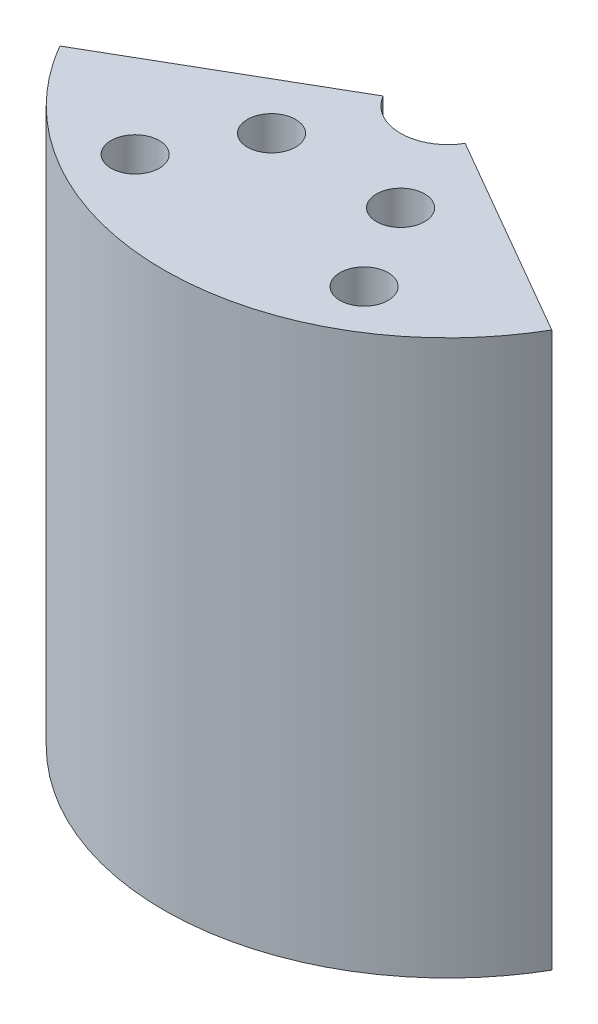
ISO-10303-21;
HEADER;
FILE_DESCRIPTION(('STEP AP214'),'2;1');
FILE_NAME('part.step','',(''),(''),'','','');
FILE_SCHEMA(('AUTOMOTIVE_DESIGN { 1 0 10303 214 1 1 1 1 }'));
ENDSEC;
DATA;
#1=APPLICATION_CONTEXT('core data for automotive mechanical design processes');
#2=APPLICATION_PROTOCOL_DEFINITION('international standard','automotive_design',2000,#1);
#3=PRODUCT_CONTEXT('',#1,'mechanical');
#4=PRODUCT('Part','Part','',(#3));
#5=PRODUCT_RELATED_PRODUCT_CATEGORY('part','',(#4));
#6=PRODUCT_DEFINITION_FORMATION('','',#4);
#7=PRODUCT_DEFINITION_CONTEXT('part definition',#1,'design');
#8=PRODUCT_DEFINITION('design','',#6,#7);
#9=PRODUCT_DEFINITION_SHAPE('','',#8);
#10=(LENGTH_UNIT() NAMED_UNIT(*) SI_UNIT(.MILLI.,.METRE.));
#11=(NAMED_UNIT(*) PLANE_ANGLE_UNIT() SI_UNIT($,.RADIAN.));
#12=(NAMED_UNIT(*) SI_UNIT($,.STERADIAN.) SOLID_ANGLE_UNIT());
#13=UNCERTAINTY_MEASURE_WITH_UNIT(LENGTH_MEASURE(1.E-05),#10,'distance_accuracy_value','');
#14=(GEOMETRIC_REPRESENTATION_CONTEXT(3) GLOBAL_UNCERTAINTY_ASSIGNED_CONTEXT((#13)) GLOBAL_UNIT_ASSIGNED_CONTEXT((#10,
#11,#12)) REPRESENTATION_CONTEXT('',''));
#15=CARTESIAN_POINT('',(0.,0.,0.));
#16=DIRECTION('',(0.,0.,1.));
#17=DIRECTION('',(1.,0.,0.));
#18=AXIS2_PLACEMENT_3D('',#15,#16,#17);
#19=CARTESIAN_POINT('',(-33250.,-157953.272,57590.689));
#20=DIRECTION('',(0.,1.,0.));
#21=DIRECTION('',(0.,0.,1.));
#22=AXIS2_PLACEMENT_3D('',#19,#20,#21);
#23=CYLINDRICAL_SURFACE('',#22,7000.00015026314);
#24=CARTESIAN_POINT('',(-33250.,-157953.272,57590.689));
#25=DIRECTION('',(0.,-1.,0.));
#26=DIRECTION('',(0.,0.,-1.));
#27=AXIS2_PLACEMENT_3D('',#24,#25,#26);
#28=CIRCLE('',#27,7000.00015026314);
#29=CARTESIAN_POINT('',(-33250.,-157953.272,50590.6888497369));
#30=VERTEX_POINT('',#29);
#31=EDGE_CURVE('E205',#30,#30,#28,.T.);
#32=ORIENTED_EDGE('',*,*,#31,.T.);
#33=EDGE_LOOP('',(#32));
#34=FACE_BOUND('',#33,.T.);
#35=CARTESIAN_POINT('',(-33250.,3112.15999999999,57590.689));
#36=DIRECTION('',(0.,1.,0.));
#37=DIRECTION('',(0.,0.,1.));
#38=AXIS2_PLACEMENT_3D('',#35,#36,#37);
#39=CIRCLE('',#38,7000.00015026314);
#40=CARTESIAN_POINT('',(-33250.,3112.15999999999,64590.6891502631));
#41=VERTEX_POINT('',#40);
#42=EDGE_CURVE('E179',#41,#41,#39,.T.);
#43=ORIENTED_EDGE('',*,*,#42,.T.);
#44=EDGE_LOOP('',(#43));
#45=FACE_BOUND('',#44,.T.);
#46=ADVANCED_FACE('F36',(#34,#45),#23,.F.);
#47=CARTESIAN_POINT('',(11907.849,-157953.272,6875.));
#48=CARTESIAN_POINT('',(11807.8029917002,-157953.272,7043.44917643503));
#49=CARTESIAN_POINT('',(11607.7110420749,-157953.272,7380.34741653924));
#50=CARTESIAN_POINT('',(11280.5432687674,-157953.272,7868.8496365709));
#51=CARTESIAN_POINT('',(10934.3293529705,-157953.272,8343.87877777583));
#52=CARTESIAN_POINT('',(10567.7239276696,-157953.272,8803.42509559759));
#53=CARTESIAN_POINT('',(10181.9264937854,-157953.272,9246.95497758903));
#54=CARTESIAN_POINT('',(9777.50173215005,-157953.272,9673.57738844818));
#55=CARTESIAN_POINT('',(9355.22319087225,-157953.272,10082.5328456161));
#56=CARTESIAN_POINT('',(8915.85433083751,-157953.272,10473.0703151653));
#57=CARTESIAN_POINT('',(8460.19994727094,-157953.272,10844.4775148157));
#58=CARTESIAN_POINT('',(7989.09116568846,-157953.272,11196.0746184059));
#59=CARTESIAN_POINT('',(7503.38906675418,-157953.272,11527.2202317423));
#60=CARTESIAN_POINT('',(7003.98140300401,-157953.272,11837.3112104943));
#61=CARTESIAN_POINT('',(6491.77849231254,-157953.272,12125.7774259476));
#62=CARTESIAN_POINT('',(5967.71790023985,-157953.272,12392.0944120155));
#63=CARTESIAN_POINT('',(5432.75689939271,-157953.272,12635.7764366266));
#64=CARTESIAN_POINT('',(4887.87098815242,-157953.272,12856.3744910789));
#65=CARTESIAN_POINT('',(4334.05754500886,-157953.272,13053.4914527496));
#66=CARTESIAN_POINT('',(3772.32669843644,-157953.272,13226.7617455036));
#67=CARTESIAN_POINT('',(3203.70503939334,-157953.272,13375.871167387));
#68=CARTESIAN_POINT('',(2629.23148733099,-157953.272,13500.5479774213));
#69=CARTESIAN_POINT('',(2049.95533036843,-157953.272,13600.5648712371));
#70=CARTESIAN_POINT('',(1466.93448935223,-157953.272,13675.736338775));
#71=CARTESIAN_POINT('',(881.23403741885,-157953.272,13725.9278364146));
#72=CARTESIAN_POINT('',(293.92372851662,-157953.272,13751.0464275311));
#73=CARTESIAN_POINT('',(-293.923728516621,-157953.272,13751.0464275311));
#74=CARTESIAN_POINT('',(-881.234037418848,-157953.272,13725.9278364146));
#75=CARTESIAN_POINT('',(-1466.93448935223,-157953.272,13675.736338775));
#76=CARTESIAN_POINT('',(-2049.95533036843,-157953.272,13600.5648712371));
#77=CARTESIAN_POINT('',(-2629.23148733099,-157953.272,13500.5479774213));
#78=CARTESIAN_POINT('',(-3203.70503939333,-157953.272,13375.871167387));
#79=CARTESIAN_POINT('',(-3772.32669843644,-157953.272,13226.7617455036));
#80=CARTESIAN_POINT('',(-4334.05754500886,-157953.272,13053.4914527496));
#81=CARTESIAN_POINT('',(-4887.87098815242,-157953.272,12856.3744910789));
#82=CARTESIAN_POINT('',(-5432.7568993927,-157953.272,12635.7764366266));
#83=CARTESIAN_POINT('',(-5967.71790023985,-157953.272,12392.0944120155));
#84=CARTESIAN_POINT('',(-6491.77849231254,-157953.272,12125.7774259476));
#85=CARTESIAN_POINT('',(-7003.98140300401,-157953.272,11837.3112104943));
#86=CARTESIAN_POINT('',(-7503.38906675418,-157953.272,11527.2202317423));
#87=CARTESIAN_POINT('',(-7989.09116568846,-157953.272,11196.0746184059));
#88=CARTESIAN_POINT('',(-8460.19994727094,-157953.272,10844.4775148157));
#89=CARTESIAN_POINT('',(-8915.8543308375,-157953.272,10473.0703151653));
#90=CARTESIAN_POINT('',(-9355.22319087226,-157953.272,10082.5328456161));
#91=CARTESIAN_POINT('',(-9777.50173215005,-157953.272,9673.57738844818));
#92=CARTESIAN_POINT('',(-10181.9264937854,-157953.272,9246.95497758902));
#93=CARTESIAN_POINT('',(-10567.7239276696,-157953.272,8803.42509559759));
#94=CARTESIAN_POINT('',(-10934.3293529705,-157953.272,8343.87877777582));
#95=CARTESIAN_POINT('',(-11280.5432687674,-157953.272,7868.8496365709));
#96=CARTESIAN_POINT('',(-11607.7110420749,-157953.272,7380.34741653924));
#97=CARTESIAN_POINT('',(-11807.8029917002,-157953.272,7043.44917643503));
#98=CARTESIAN_POINT('',(-11907.849,-157953.272,6875.));
#99=B_SPLINE_CURVE_WITH_KNOTS('',3,(#47,#48,#49,#50,#51,#52,#53,#54,#55,#56,#57,#58,#59,#60,#61,
#62,#63,#64,#65,#66,#67,#68,#69,#70,#71,#72,#73,#74,#75,#76,#77,#78,#79,#80,#81,#82,#83,#84,#85,
#86,#87,#88,#89,#90,#91,#92,#93,#94,#95,#96,#97,#98),.UNSPECIFIED.,.F.,.F.,(4,1,1,1,1,1,1,1,1,1,
1,1,1,1,1,1,1,1,1,1,1,1,1,1,1,1,1,1,1,1,1,1,1,1,1,1,1,1,1,1,1,1,1,1,1,1,1,1,1,4),(0.,
0.0204081614125654,0.0408163091631843,0.0612244668065007,0.0816326637209554,0.102040816456261,
0.122448986277325,0.14285713665867,0.163265314964195,0.183673483811991,0.204081628745621,
0.224489780404567,0.244897949632334,0.265306133760453,0.285714296840873,0.306122442363311,
0.326530616551146,0.346938779267077,0.36734694954588,0.387755093104847,0.408163266710552,
0.428571434066356,0.44897958146788,0.469387737987828,0.489795921226444,0.510204078773556,
0.530612262012172,0.551020418532121,0.571428565933645,0.591836733289448,0.612244906895153,
0.63265305045412,0.653061220732923,0.673469383448854,0.693877557636689,0.714285703159127,
0.734693866239547,0.755102050367667,0.775510219595433,0.795918371254379,0.816326516188009,
0.836734685035805,0.85714286334133,0.877551013722675,0.897959183543739,0.918367336279045,
0.938775533193499,0.959183690836816,0.979591838587435,1.),.UNSPECIFIED.);
#100=DIRECTION('',(0.,1.,0.));
#101=VECTOR('',#100,1.);
#102=SURFACE_OF_LINEAR_EXTRUSION('',#99,#101);
#103=DIRECTION('',(0.,1.,0.));
#104=VECTOR('',#103,1.);
#105=CARTESIAN_POINT('',(-11907.849,-157953.272,6875.));
#106=LINE('',#105,#104);
#107=CARTESIAN_POINT('',(-11907.849,-157953.272,6875.));
#108=VERTEX_POINT('',#107);
#109=CARTESIAN_POINT('',(-11907.849,3112.15999999996,6875.));
#110=VERTEX_POINT('',#109);
#111=EDGE_CURVE('E91',#108,#110,#106,.T.);
#112=ORIENTED_EDGE('',*,*,#111,.T.);
#113=CARTESIAN_POINT('',(11907.849,3112.15999999996,6875.));
#114=CARTESIAN_POINT('',(11807.8029917002,3112.15999999996,7043.44917643503));
#115=CARTESIAN_POINT('',(11607.7110420749,3112.1599999999,7380.34741653924));
#116=CARTESIAN_POINT('',(11280.5432687674,3112.15999999993,7868.8496365709));
#117=CARTESIAN_POINT('',(10934.3293529705,3112.15999999999,8343.87877777583));
#118=CARTESIAN_POINT('',(10567.7239276696,3112.15999999996,8803.42509559759));
#119=CARTESIAN_POINT('',(10181.9264937854,3112.15999999996,9246.95497758903));
#120=CARTESIAN_POINT('',(9777.50173215005,3112.15999999999,9673.57738844818));
#121=CARTESIAN_POINT('',(9355.22319087225,3112.15999999996,10082.5328456161));
#122=CARTESIAN_POINT('',(8915.85433083751,3112.1599999999,10473.0703151653));
#123=CARTESIAN_POINT('',(8460.19994727094,3112.15999999999,10844.4775148157));
#124=CARTESIAN_POINT('',(7989.09116568846,3112.15999999996,11196.0746184059));
#125=CARTESIAN_POINT('',(7503.38906675418,3112.15999999999,11527.2202317423));
#126=CARTESIAN_POINT('',(7003.98140300401,3112.1599999999,11837.3112104943));
#127=CARTESIAN_POINT('',(6491.77849231254,3112.16000000005,12125.7774259476));
#128=CARTESIAN_POINT('',(5967.71790023985,3112.15999999993,12392.0944120155));
#129=CARTESIAN_POINT('',(5432.75689939271,3112.15999999993,12635.7764366266));
#130=CARTESIAN_POINT('',(4887.87098815242,3112.15999999996,12856.3744910789));
#131=CARTESIAN_POINT('',(4334.05754500886,3112.15999999993,13053.4914527496));
#132=CARTESIAN_POINT('',(3772.32669843644,3112.15999999996,13226.7617455036));
#133=CARTESIAN_POINT('',(3203.70503939334,3112.15999999996,13375.871167387));
#134=CARTESIAN_POINT('',(2629.23148733099,3112.15999999996,13500.5479774213));
#135=CARTESIAN_POINT('',(2049.95533036843,3112.15999999996,13600.5648712371));
#136=CARTESIAN_POINT('',(1466.93448935223,3112.15999999996,13675.736338775));
#137=CARTESIAN_POINT('',(881.23403741885,3112.15999999996,13725.9278364146));
#138=CARTESIAN_POINT('',(293.92372851662,3112.15999999999,13751.0464275311));
#139=CARTESIAN_POINT('',(-293.923728516621,3112.15999999996,13751.0464275311));
#140=CARTESIAN_POINT('',(-881.234037418848,3112.16000000002,13725.9278364146));
#141=CARTESIAN_POINT('',(-1466.93448935223,3112.15999999993,13675.736338775));
#142=CARTESIAN_POINT('',(-2049.95533036843,3112.15999999999,13600.5648712371));
#143=CARTESIAN_POINT('',(-2629.23148733099,3112.15999999999,13500.5479774213));
#144=CARTESIAN_POINT('',(-3203.70503939333,3112.15999999996,13375.871167387));
#145=CARTESIAN_POINT('',(-3772.32669843644,3112.15999999993,13226.7617455036));
#146=CARTESIAN_POINT('',(-4334.05754500886,3112.15999999996,13053.4914527496));
#147=CARTESIAN_POINT('',(-4887.87098815242,3112.15999999996,12856.3744910789));
#148=CARTESIAN_POINT('',(-5432.7568993927,3112.1599999999,12635.7764366266));
#149=CARTESIAN_POINT('',(-5967.71790023985,3112.15999999996,12392.0944120155));
#150=CARTESIAN_POINT('',(-6491.77849231254,3112.16000000002,12125.7774259476));
#151=CARTESIAN_POINT('',(-7003.98140300401,3112.15999999996,11837.3112104943));
#152=CARTESIAN_POINT('',(-7503.38906675418,3112.15999999996,11527.2202317423));
#153=CARTESIAN_POINT('',(-7989.09116568846,3112.15999999996,11196.0746184059));
#154=CARTESIAN_POINT('',(-8460.19994727094,3112.15999999993,10844.4775148157));
#155=CARTESIAN_POINT('',(-8915.8543308375,3112.16000000002,10473.0703151653));
#156=CARTESIAN_POINT('',(-9355.22319087226,3112.1599999999,10082.5328456161));
#157=CARTESIAN_POINT('',(-9777.50173215005,3112.15999999993,9673.57738844818));
#158=CARTESIAN_POINT('',(-10181.9264937854,3112.15999999996,9246.95497758902));
#159=CARTESIAN_POINT('',(-10567.7239276696,3112.15999999996,8803.42509559759));
#160=CARTESIAN_POINT('',(-10934.3293529705,3112.16000000002,8343.87877777582));
#161=CARTESIAN_POINT('',(-11280.5432687674,3112.1599999999,7868.8496365709));
#162=CARTESIAN_POINT('',(-11607.7110420749,3112.15999999999,7380.34741653924));
#163=CARTESIAN_POINT('',(-11807.8029917002,3112.15999999996,7043.44917643503));
#164=CARTESIAN_POINT('',(-11907.849,3112.15999999996,6875.));
#165=B_SPLINE_CURVE_WITH_KNOTS('',3,(#113,#114,#115,#116,#117,#118,#119,#120,#121,#122,#123,
#124,#125,#126,#127,#128,#129,#130,#131,#132,#133,#134,#135,#136,#137,#138,#139,#140,#141,#142,
#143,#144,#145,#146,#147,#148,#149,#150,#151,#152,#153,#154,#155,#156,#157,#158,#159,#160,#161,
#162,#163,#164),.UNSPECIFIED.,.F.,.F.,(4,1,1,1,1,1,1,1,1,1,1,1,1,1,1,1,1,1,1,1,1,1,1,1,1,1,1,1,
1,1,1,1,1,1,1,1,1,1,1,1,1,1,1,1,1,1,1,1,1,4),(0.,0.0204081614125654,0.0408163091631843,
0.0612244668065007,0.0816326637209554,0.102040816456261,0.122448986277325,0.14285713665867,
0.163265314964195,0.183673483811991,0.204081628745621,0.224489780404567,0.244897949632334,
0.265306133760453,0.285714296840873,0.306122442363311,0.326530616551146,0.346938779267077,
0.36734694954588,0.387755093104847,0.408163266710552,0.428571434066356,0.44897958146788,
0.469387737987828,0.489795921226444,0.510204078773556,0.530612262012172,0.551020418532121,
0.571428565933645,0.591836733289448,0.612244906895153,0.63265305045412,0.653061220732923,
0.673469383448854,0.693877557636689,0.714285703159127,0.734693866239547,0.755102050367667,
0.775510219595433,0.795918371254379,0.816326516188009,0.836734685035805,0.85714286334133,
0.877551013722675,0.897959183543739,0.918367336279045,0.938775533193499,0.959183690836816,
0.979591838587435,1.),.UNSPECIFIED.);
#166=CARTESIAN_POINT('',(11907.849,3112.16000001824,6875.));
#167=VERTEX_POINT('',#166);
#168=EDGE_CURVE('E78',#110,#167,#165,.F.);
#169=ORIENTED_EDGE('',*,*,#168,.T.);
#170=DIRECTION('',(0.,1.,0.));
#171=VECTOR('',#170,1.);
#172=CARTESIAN_POINT('',(11907.849,-157953.272,6875.));
#173=LINE('',#172,#171);
#174=CARTESIAN_POINT('',(11907.849,-157953.272,6875.));
#175=VERTEX_POINT('',#174);
#176=EDGE_CURVE('E99',#175,#167,#173,.T.);
#177=ORIENTED_EDGE('',*,*,#176,.F.);
#178=EDGE_CURVE('E45',#175,#108,#99,.T.);
#179=ORIENTED_EDGE('',*,*,#178,.T.);
#180=EDGE_LOOP('',(#112,#169,#177,#179));
#181=FACE_BOUND('',#180,.T.);
#182=ADVANCED_FACE('F97',(#181),#102,.T.);
#183=CARTESIAN_POINT('',(71447.096,-157953.272,41250.));
#184=DIRECTION('',(0.499999996914935,0.,-0.866025405565602));
#185=DIRECTION('',(-0.866025405565602,0.,-0.499999996914935));
#186=AXIS2_PLACEMENT_3D('',#183,#184,#185);
#187=PLANE('',#186);
#188=ORIENTED_EDGE('',*,*,#176,.T.);
#189=DIRECTION('',(0.866025405565602,0.,0.499999996914935));
#190=VECTOR('',#189,1.);
#191=CARTESIAN_POINT('',(71447.096,3112.15999999999,41250.));
#192=LINE('',#191,#190);
#193=CARTESIAN_POINT('',(71447.096,3112.15999999999,41250.));
#194=VERTEX_POINT('',#193);
#195=EDGE_CURVE('E53',#167,#194,#192,.T.);
#196=ORIENTED_EDGE('',*,*,#195,.T.);
#197=DIRECTION('',(0.,1.,0.));
#198=VECTOR('',#197,1.);
#199=CARTESIAN_POINT('',(71447.096,-157953.272,41250.));
#200=LINE('',#199,#198);
#201=CARTESIAN_POINT('',(71447.096,-157953.272,41250.));
#202=VERTEX_POINT('',#201);
#203=EDGE_CURVE('E112',#202,#194,#200,.T.);
#204=ORIENTED_EDGE('',*,*,#203,.F.);
#205=DIRECTION('',(-0.866025405565602,0.,-0.499999996914935));
#206=VECTOR('',#205,1.);
#207=CARTESIAN_POINT('',(71447.096,-157953.272,41250.));
#208=LINE('',#207,#206);
#209=EDGE_CURVE('E12',#202,#175,#208,.T.);
#210=ORIENTED_EDGE('',*,*,#209,.T.);
#211=EDGE_LOOP('',(#188,#196,#204,#210));
#212=FACE_BOUND('',#211,.T.);
#213=ADVANCED_FACE('F144',(#212),#187,.T.);
#214=CARTESIAN_POINT('',(-71447.096,-157953.272,41250.));
#215=DIRECTION('',(0.499999996914935,0.,0.866025405565602));
#216=DIRECTION('',(0.866025405565602,0.,-0.499999996914935));
#217=AXIS2_PLACEMENT_3D('',#214,#215,#216);
#218=PLANE('',#217);
#219=DIRECTION('',(-0.866025405565602,0.,0.499999996914935));
#220=VECTOR('',#219,1.);
#221=CARTESIAN_POINT('',(-71447.096,3112.15999999999,41250.));
#222=LINE('',#221,#220);
#223=CARTESIAN_POINT('',(-71447.096,3112.15999999999,41250.));
#224=VERTEX_POINT('',#223);
#225=EDGE_CURVE('E81',#110,#224,#222,.T.);
#226=ORIENTED_EDGE('',*,*,#225,.F.);
#227=ORIENTED_EDGE('',*,*,#111,.F.);
#228=DIRECTION('',(0.866025405565602,0.,-0.499999996914935));
#229=VECTOR('',#228,1.);
#230=CARTESIAN_POINT('',(-71447.096,-157953.272,41250.));
#231=LINE('',#230,#229);
#232=CARTESIAN_POINT('',(-71447.096,-157953.272,41250.));
#233=VERTEX_POINT('',#232);
#234=EDGE_CURVE('E100',#233,#108,#231,.T.);
#235=ORIENTED_EDGE('',*,*,#234,.F.);
#236=DIRECTION('',(0.,1.,0.));
#237=VECTOR('',#236,1.);
#238=CARTESIAN_POINT('',(-71447.096,-157953.272,41250.));
#239=LINE('',#238,#237);
#240=EDGE_CURVE('E93',#233,#224,#239,.T.);
#241=ORIENTED_EDGE('',*,*,#240,.T.);
#242=EDGE_LOOP('',(#226,#227,#235,#241));
#243=FACE_BOUND('',#242,.T.);
#244=ADVANCED_FACE('F90',(#243),#218,.F.);
#245=CARTESIAN_POINT('',(71447.096,-157953.272,41250.));
#246=CARTESIAN_POINT('',(70846.820924852,-157953.272,42260.695813468));
#247=CARTESIAN_POINT('',(69646.2708090548,-157953.272,44282.0873823177));
#248=CARTESIAN_POINT('',(67683.2548620857,-157953.272,47213.0963009341));
#249=CARTESIAN_POINT('',(65605.974850452,-157953.272,50063.2726987564));
#250=CARTESIAN_POINT('',(63406.344878433,-157953.272,52820.5514167271));
#251=CARTESIAN_POINT('',(61091.563742276,-157953.272,55481.7314892934));
#252=CARTESIAN_POINT('',(58665.009261846,-157953.272,58041.4616113927));
#253=CARTESIAN_POINT('',(56131.3416965385,-157953.272,60495.1975743603));
#254=CARTESIAN_POINT('',(53495.1290662169,-157953.272,62838.4229081262));
#255=CARTESIAN_POINT('',(50761.2001000836,-157953.272,65066.8627560023));
#256=CARTESIAN_POINT('',(47934.548091761,-157953.272,67176.4488403377));
#257=CARTESIAN_POINT('',(45020.3356792746,-157953.272,69163.3252095413));
#258=CARTESIAN_POINT('',(42023.88542843,-157953.272,71023.8628649924));
#259=CARTESIAN_POINT('',(38950.6723488195,-157953.272,72754.664655511));
#260=CARTESIAN_POINT('',(35806.3093683436,-157953.272,74352.5684266598));
#261=CARTESIAN_POINT('',(32596.5397878142,-157953.272,75814.6528644993));
#262=CARTESIAN_POINT('',(29327.2282760871,-157953.272,77138.2517591343));
#263=CARTESIAN_POINT('',(26004.3449266081,-157953.272,78320.9429291428));
#264=CARTESIAN_POINT('',(22633.9606959911,-157953.272,79360.570302926));
#265=CARTESIAN_POINT('',(19222.2313598535,-157953.272,80255.2301267456));
#266=CARTESIAN_POINT('',(15775.389500045,-157953.272,81003.290798711));
#267=CARTESIAN_POINT('',(12299.7315138552,-157953.272,81603.3868891131));
#268=CARTESIAN_POINT('',(8801.60579492223,-157953.272,82054.4197516543));
#269=CARTESIAN_POINT('',(5287.40287829841,-157953.272,82355.5679407754));
#270=CARTESIAN_POINT('',(1763.54135385741,-157953.272,82506.2784266103));
#271=CARTESIAN_POINT('',(-1763.54135385741,-157953.272,82506.2784266102));
#272=CARTESIAN_POINT('',(-5287.40287829841,-157953.272,82355.5679407754));
#273=CARTESIAN_POINT('',(-8801.60579492223,-157953.272,82054.4197516542));
#274=CARTESIAN_POINT('',(-12299.7315138552,-157953.272,81603.3868891131));
#275=CARTESIAN_POINT('',(-15775.389500045,-157953.272,81003.290798711));
#276=CARTESIAN_POINT('',(-19222.2313598535,-157953.272,80255.2301267456));
#277=CARTESIAN_POINT('',(-22633.9606959912,-157953.272,79360.570302926));
#278=CARTESIAN_POINT('',(-26004.3449266081,-157953.272,78320.9429291428));
#279=CARTESIAN_POINT('',(-29327.2282760871,-157953.272,77138.2517591343));
#280=CARTESIAN_POINT('',(-32596.5397878142,-157953.272,75814.6528644993));
#281=CARTESIAN_POINT('',(-35806.3093683436,-157953.272,74352.5684266598));
#282=CARTESIAN_POINT('',(-38950.6723488194,-157953.272,72754.664655511));
#283=CARTESIAN_POINT('',(-42023.88542843,-157953.272,71023.8628649924));
#284=CARTESIAN_POINT('',(-45020.3356792746,-157953.272,69163.3252095413));
#285=CARTESIAN_POINT('',(-47934.548091761,-157953.272,67176.4488403377));
#286=CARTESIAN_POINT('',(-50761.2001000836,-157953.272,65066.8627560023));
#287=CARTESIAN_POINT('',(-53495.1290662169,-157953.272,62838.4229081262));
#288=CARTESIAN_POINT('',(-56131.3416965385,-157953.272,60495.1975743603));
#289=CARTESIAN_POINT('',(-58665.009261846,-157953.272,58041.4616113927));
#290=CARTESIAN_POINT('',(-61091.563742276,-157953.272,55481.7314892934));
#291=CARTESIAN_POINT('',(-63406.344878433,-157953.272,52820.5514167271));
#292=CARTESIAN_POINT('',(-65605.974850452,-157953.272,50063.2726987564));
#293=CARTESIAN_POINT('',(-67683.2548620857,-157953.272,47213.0963009341));
#294=CARTESIAN_POINT('',(-69646.2708090548,-157953.272,44282.0873823177));
#295=CARTESIAN_POINT('',(-70846.820924852,-157953.272,42260.695813468));
#296=CARTESIAN_POINT('',(-71447.096,-157953.272,41250.));
#297=B_SPLINE_CURVE_WITH_KNOTS('',3,(#245,#246,#247,#248,#249,#250,#251,#252,#253,#254,#255,
#256,#257,#258,#259,#260,#261,#262,#263,#264,#265,#266,#267,#268,#269,#270,#271,#272,#273,#274,
#275,#276,#277,#278,#279,#280,#281,#282,#283,#284,#285,#286,#287,#288,#289,#290,#291,#292,#293,
#294,#295,#296),.UNSPECIFIED.,.F.,.F.,(4,1,1,1,1,1,1,1,1,1,1,1,1,1,1,1,1,1,1,1,1,1,1,1,1,1,1,1,
1,1,1,1,1,1,1,1,1,1,1,1,1,1,1,1,1,1,1,1,1,4),(0.,0.0204081630235338,0.0408163248741793,
0.0612244915298361,0.081632652878558,0.102040814009408,0.122448978854566,0.142857140977413,
0.163265306447665,0.183673472130014,0.204081631749435,0.224489799155513,0.244897957696707,
0.265306124154539,0.285714289518992,0.306122450973539,0.326530609879694,0.346938775399991,
0.367346937691204,0.387755103580357,0.408163264307964,0.42857142837141,0.448979594136231,
0.469387756084834,0.489795915607603,0.510204084392397,0.530612243915166,0.551020405863769,
0.571428571628589,0.591836735692036,0.612244896419643,0.632653062308796,0.653061224600009,
0.673469390120306,0.693877549026461,0.714285710481008,0.73469387584546,0.755102042303293,
0.775510200844487,0.795918368250565,0.816326527869986,0.836734693552335,0.857142859022587,
0.877551021145434,0.897959185990592,0.918367347121442,0.938775508470164,0.959183675125821,
0.979591836976466,1.),.UNSPECIFIED.);
#298=DIRECTION('',(0.,1.,0.));
#299=VECTOR('',#298,1.);
#300=SURFACE_OF_LINEAR_EXTRUSION('',#297,#299);
#301=CARTESIAN_POINT('',(71447.096,3112.15999999999,41250.));
#302=CARTESIAN_POINT('',(70846.820924852,3112.15999999993,42260.695813468));
#303=CARTESIAN_POINT('',(69646.2708090548,3112.15999999993,44282.0873823177));
#304=CARTESIAN_POINT('',(67683.2548620857,3112.15999999999,47213.0963009341));
#305=CARTESIAN_POINT('',(65605.974850452,3112.15999999996,50063.2726987564));
#306=CARTESIAN_POINT('',(63406.344878433,3112.15999999999,52820.5514167271));
#307=CARTESIAN_POINT('',(61091.563742276,3112.15999999999,55481.7314892934));
#308=CARTESIAN_POINT('',(58665.009261846,3112.15999999999,58041.4616113927));
#309=CARTESIAN_POINT('',(56131.3416965385,3112.16000000002,60495.1975743603));
#310=CARTESIAN_POINT('',(53495.1290662169,3112.15999999996,62838.4229081262));
#311=CARTESIAN_POINT('',(50761.2001000836,3112.16000000002,65066.8627560023));
#312=CARTESIAN_POINT('',(47934.548091761,3112.15999999999,67176.4488403377));
#313=CARTESIAN_POINT('',(45020.3356792746,3112.15999999996,69163.3252095413));
#314=CARTESIAN_POINT('',(42023.88542843,3112.16000000002,71023.8628649924));
#315=CARTESIAN_POINT('',(38950.6723488195,3112.15999999999,72754.664655511));
#316=CARTESIAN_POINT('',(35806.3093683436,3112.15999999999,74352.5684266598));
#317=CARTESIAN_POINT('',(32596.5397878142,3112.15999999999,75814.6528644993));
#318=CARTESIAN_POINT('',(29327.2282760871,3112.16000000002,77138.2517591343));
#319=CARTESIAN_POINT('',(26004.3449266081,3112.15999999996,78320.9429291428));
#320=CARTESIAN_POINT('',(22633.9606959911,3112.16000000002,79360.570302926));
#321=CARTESIAN_POINT('',(19222.2313598535,3112.16000000002,80255.2301267456));
#322=CARTESIAN_POINT('',(15775.389500045,3112.15999999999,81003.290798711));
#323=CARTESIAN_POINT('',(12299.7315138552,3112.15999999999,81603.3868891131));
#324=CARTESIAN_POINT('',(8801.60579492223,3112.15999999993,82054.4197516543));
#325=CARTESIAN_POINT('',(5287.40287829841,3112.15999999999,82355.5679407754));
#326=CARTESIAN_POINT('',(1763.54135385741,3112.15999999999,82506.2784266103));
#327=CARTESIAN_POINT('',(-1763.54135385741,3112.15999999999,82506.2784266102));
#328=CARTESIAN_POINT('',(-5287.40287829841,3112.15999999996,82355.5679407754));
#329=CARTESIAN_POINT('',(-8801.60579492223,3112.16000000002,82054.4197516542));
#330=CARTESIAN_POINT('',(-12299.7315138552,3112.15999999996,81603.3868891131));
#331=CARTESIAN_POINT('',(-15775.389500045,3112.16000000002,81003.290798711));
#332=CARTESIAN_POINT('',(-19222.2313598535,3112.16000000002,80255.2301267456));
#333=CARTESIAN_POINT('',(-22633.9606959912,3112.16000000002,79360.570302926));
#334=CARTESIAN_POINT('',(-26004.3449266081,3112.15999999993,78320.9429291428));
#335=CARTESIAN_POINT('',(-29327.2282760871,3112.15999999996,77138.2517591343));
#336=CARTESIAN_POINT('',(-32596.5397878142,3112.15999999999,75814.6528644993));
#337=CARTESIAN_POINT('',(-35806.3093683436,3112.15999999996,74352.5684266598));
#338=CARTESIAN_POINT('',(-38950.6723488194,3112.16000000002,72754.664655511));
#339=CARTESIAN_POINT('',(-42023.88542843,3112.15999999996,71023.8628649924));
#340=CARTESIAN_POINT('',(-45020.3356792746,3112.15999999996,69163.3252095413));
#341=CARTESIAN_POINT('',(-47934.548091761,3112.16000000002,67176.4488403377));
#342=CARTESIAN_POINT('',(-50761.2001000836,3112.15999999999,65066.8627560023));
#343=CARTESIAN_POINT('',(-53495.1290662169,3112.15999999999,62838.4229081262));
#344=CARTESIAN_POINT('',(-56131.3416965385,3112.15999999999,60495.1975743603));
#345=CARTESIAN_POINT('',(-58665.009261846,3112.15999999999,58041.4616113927));
#346=CARTESIAN_POINT('',(-61091.563742276,3112.16000000002,55481.7314892934));
#347=CARTESIAN_POINT('',(-63406.344878433,3112.16000000002,52820.5514167271));
#348=CARTESIAN_POINT('',(-65605.974850452,3112.15999999993,50063.2726987564));
#349=CARTESIAN_POINT('',(-67683.2548620857,3112.15999999996,47213.0963009341));
#350=CARTESIAN_POINT('',(-69646.2708090548,3112.16000000005,44282.0873823177));
#351=CARTESIAN_POINT('',(-70846.820924852,3112.15999999999,42260.695813468));
#352=CARTESIAN_POINT('',(-71447.096,3112.15999999999,41250.));
#353=B_SPLINE_CURVE_WITH_KNOTS('',3,(#301,#302,#303,#304,#305,#306,#307,#308,#309,#310,#311,
#312,#313,#314,#315,#316,#317,#318,#319,#320,#321,#322,#323,#324,#325,#326,#327,#328,#329,#330,
#331,#332,#333,#334,#335,#336,#337,#338,#339,#340,#341,#342,#343,#344,#345,#346,#347,#348,#349,
#350,#351,#352),.UNSPECIFIED.,.F.,.F.,(4,1,1,1,1,1,1,1,1,1,1,1,1,1,1,1,1,1,1,1,1,1,1,1,1,1,1,1,
1,1,1,1,1,1,1,1,1,1,1,1,1,1,1,1,1,1,1,1,1,4),(0.,0.0204081630235338,0.0408163248741793,
0.0612244915298361,0.081632652878558,0.102040814009408,0.122448978854566,0.142857140977413,
0.163265306447665,0.183673472130014,0.204081631749435,0.224489799155513,0.244897957696707,
0.265306124154539,0.285714289518992,0.306122450973539,0.326530609879694,0.346938775399991,
0.367346937691204,0.387755103580357,0.408163264307964,0.42857142837141,0.448979594136231,
0.469387756084834,0.489795915607603,0.510204084392397,0.530612243915166,0.551020405863769,
0.571428571628589,0.591836735692036,0.612244896419643,0.632653062308796,0.653061224600009,
0.673469390120306,0.693877549026461,0.714285710481008,0.73469387584546,0.755102042303293,
0.775510200844487,0.795918368250565,0.816326527869986,0.836734693552335,0.857142859022587,
0.877551021145434,0.897959185990592,0.918367347121442,0.938775508470164,0.959183675125821,
0.979591836976466,1.),.UNSPECIFIED.);
#354=EDGE_CURVE('E95',#224,#194,#353,.F.);
#355=ORIENTED_EDGE('',*,*,#354,.F.);
#356=ORIENTED_EDGE('',*,*,#240,.F.);
#357=EDGE_CURVE('E61',#202,#233,#297,.T.);
#358=ORIENTED_EDGE('',*,*,#357,.F.);
#359=ORIENTED_EDGE('',*,*,#203,.T.);
#360=EDGE_LOOP('',(#355,#356,#358,#359));
#361=FACE_BOUND('',#360,.T.);
#362=ADVANCED_FACE('F136',(#361),#300,.F.);
#363=CARTESIAN_POINT('',(-18750.,-157953.272,32475.953));
#364=DIRECTION('',(0.,1.,0.));
#365=DIRECTION('',(0.,0.,1.));
#366=AXIS2_PLACEMENT_3D('',#363,#364,#365);
#367=CYLINDRICAL_SURFACE('',#366,6999.99928423775);
#368=CARTESIAN_POINT('',(-18750.,-157953.272,32475.953));
#369=DIRECTION('',(0.,-1.,0.));
#370=DIRECTION('',(0.,0.,-1.));
#371=AXIS2_PLACEMENT_3D('',#368,#369,#370);
#372=CIRCLE('',#371,6999.99928423775);
#373=CARTESIAN_POINT('',(-18750.,-157953.272,25475.9537157622));
#374=VERTEX_POINT('',#373);
#375=EDGE_CURVE('E116',#374,#374,#372,.T.);
#376=ORIENTED_EDGE('',*,*,#375,.T.);
#377=EDGE_LOOP('',(#376));
#378=FACE_BOUND('',#377,.T.);
#379=CARTESIAN_POINT('',(-18750.,3112.15999999999,32475.953));
#380=DIRECTION('',(0.,1.,0.));
#381=DIRECTION('',(0.,0.,1.));
#382=AXIS2_PLACEMENT_3D('',#379,#380,#381);
#383=CIRCLE('',#382,6999.99928423775);
#384=CARTESIAN_POINT('',(-18750.,3112.15999999999,39475.9522842377));
#385=VERTEX_POINT('',#384);
#386=EDGE_CURVE('E86',#385,#385,#383,.T.);
#387=ORIENTED_EDGE('',*,*,#386,.T.);
#388=EDGE_LOOP('',(#387));
#389=FACE_BOUND('',#388,.T.);
#390=ADVANCED_FACE('F140',(#378,#389),#367,.F.);
#391=CARTESIAN_POINT('',(18750.,-157953.272,32475.953));
#392=DIRECTION('',(0.,1.,0.));
#393=DIRECTION('',(0.,0.,1.));
#394=AXIS2_PLACEMENT_3D('',#391,#392,#393);
#395=CYLINDRICAL_SURFACE('',#394,6999.99928423775);
#396=CARTESIAN_POINT('',(18750.,-157953.272,32475.953));
#397=DIRECTION('',(0.,-1.,0.));
#398=DIRECTION('',(0.,0.,-1.));
#399=AXIS2_PLACEMENT_3D('',#396,#397,#398);
#400=CIRCLE('',#399,6999.99928423775);
#401=CARTESIAN_POINT('',(18750.,-157953.272,25475.9537157622));
#402=VERTEX_POINT('',#401);
#403=EDGE_CURVE('E202',#402,#402,#400,.T.);
#404=ORIENTED_EDGE('',*,*,#403,.T.);
#405=EDGE_LOOP('',(#404));
#406=FACE_BOUND('',#405,.T.);
#407=CARTESIAN_POINT('',(18750.,3112.15999999999,32475.953));
#408=DIRECTION('',(0.,1.,0.));
#409=DIRECTION('',(0.,0.,1.));
#410=AXIS2_PLACEMENT_3D('',#407,#408,#409);
#411=CIRCLE('',#410,6999.99928423775);
#412=CARTESIAN_POINT('',(18750.,3112.15999999999,39475.9522842377));
#413=VERTEX_POINT('',#412);
#414=EDGE_CURVE('E175',#413,#413,#411,.T.);
#415=ORIENTED_EDGE('',*,*,#414,.T.);
#416=EDGE_LOOP('',(#415));
#417=FACE_BOUND('',#416,.T.);
#418=ADVANCED_FACE('F157',(#406,#417),#395,.F.);
#419=CARTESIAN_POINT('',(-114335.848416319,-157953.272,44690.6392133051));
#420=DIRECTION('',(0.,1.,0.));
#421=DIRECTION('',(0.,0.,1.));
#422=AXIS2_PLACEMENT_3D('',#419,#420,#421);
#423=PLANE('',#422);
#424=ORIENTED_EDGE('',*,*,#403,.F.);
#425=EDGE_LOOP('',(#424));
#426=FACE_BOUND('',#425,.T.);
#427=ORIENTED_EDGE('',*,*,#375,.F.);
#428=EDGE_LOOP('',(#427));
#429=FACE_BOUND('',#428,.T.);
#430=ORIENTED_EDGE('',*,*,#209,.F.);
#431=ORIENTED_EDGE('',*,*,#357,.T.);
#432=ORIENTED_EDGE('',*,*,#234,.T.);
#433=ORIENTED_EDGE('',*,*,#178,.F.);
#434=EDGE_LOOP('',(#430,#431,#432,#433));
#435=FACE_BOUND('',#434,.T.);
#436=ORIENTED_EDGE('',*,*,#31,.F.);
#437=EDGE_LOOP('',(#436));
#438=FACE_BOUND('',#437,.T.);
#439=CARTESIAN_POINT('',(33250.,-157953.272,57590.689));
#440=DIRECTION('',(0.,-1.,0.));
#441=DIRECTION('',(0.,0.,-1.));
#442=AXIS2_PLACEMENT_3D('',#439,#440,#441);
#443=CIRCLE('',#442,7000.00015026314);
#444=CARTESIAN_POINT('',(33250.,-157953.272,50590.6888497369));
#445=VERTEX_POINT('',#444);
#446=EDGE_CURVE('E196',#445,#445,#443,.T.);
#447=ORIENTED_EDGE('',*,*,#446,.F.);
#448=EDGE_LOOP('',(#447));
#449=FACE_BOUND('',#448,.T.);
#450=ADVANCED_FACE('F38',(#426,#429,#435,#438,#449),#423,.F.);
#451=CARTESIAN_POINT('',(33250.,-157953.272,57590.689));
#452=DIRECTION('',(0.,1.,0.));
#453=DIRECTION('',(0.,0.,1.));
#454=AXIS2_PLACEMENT_3D('',#451,#452,#453);
#455=CYLINDRICAL_SURFACE('',#454,7000.00015026314);
#456=ORIENTED_EDGE('',*,*,#446,.T.);
#457=EDGE_LOOP('',(#456));
#458=FACE_BOUND('',#457,.T.);
#459=CARTESIAN_POINT('',(33250.,3112.15999999999,57590.689));
#460=DIRECTION('',(0.,1.,0.));
#461=DIRECTION('',(0.,0.,1.));
#462=AXIS2_PLACEMENT_3D('',#459,#460,#461);
#463=CIRCLE('',#462,7000.00015026314);
#464=CARTESIAN_POINT('',(33250.,3112.15999999999,64590.6891502631));
#465=VERTEX_POINT('',#464);
#466=EDGE_CURVE('E40',#465,#465,#463,.T.);
#467=ORIENTED_EDGE('',*,*,#466,.T.);
#468=EDGE_LOOP('',(#467));
#469=FACE_BOUND('',#468,.T.);
#470=ADVANCED_FACE('F161',(#458,#469),#455,.F.);
#471=CARTESIAN_POINT('',(0.,3112.16,0.));
#472=DIRECTION('',(0.,1.,0.));
#473=DIRECTION('',(0.,0.,1.));
#474=AXIS2_PLACEMENT_3D('',#471,#472,#473);
#475=PLANE('',#474);
#476=ORIENTED_EDGE('',*,*,#466,.F.);
#477=EDGE_LOOP('',(#476));
#478=FACE_BOUND('',#477,.T.);
#479=ORIENTED_EDGE('',*,*,#414,.F.);
#480=EDGE_LOOP('',(#479));
#481=FACE_BOUND('',#480,.T.);
#482=ORIENTED_EDGE('',*,*,#42,.F.);
#483=EDGE_LOOP('',(#482));
#484=FACE_BOUND('',#483,.T.);
#485=ORIENTED_EDGE('',*,*,#386,.F.);
#486=EDGE_LOOP('',(#485));
#487=FACE_BOUND('',#486,.T.);
#488=ORIENTED_EDGE('',*,*,#225,.T.);
#489=ORIENTED_EDGE('',*,*,#354,.T.);
#490=ORIENTED_EDGE('',*,*,#195,.F.);
#491=ORIENTED_EDGE('',*,*,#168,.F.);
#492=EDGE_LOOP('',(#488,#489,#490,#491));
#493=FACE_BOUND('',#492,.T.);
#494=ADVANCED_FACE('F80',(#478,#481,#484,#487,#493),#475,.T.);
#495=CLOSED_SHELL('',(#46,#182,#213,#244,#362,#390,#418,#450,#470,#494));
#496=MANIFOLD_SOLID_BREP('B2',#495);
#497=ADVANCED_BREP_SHAPE_REPRESENTATION('',(#18,#496),#14);
#498=SHAPE_DEFINITION_REPRESENTATION(#9,#497);
ENDSEC;
END-ISO-10303-21;
